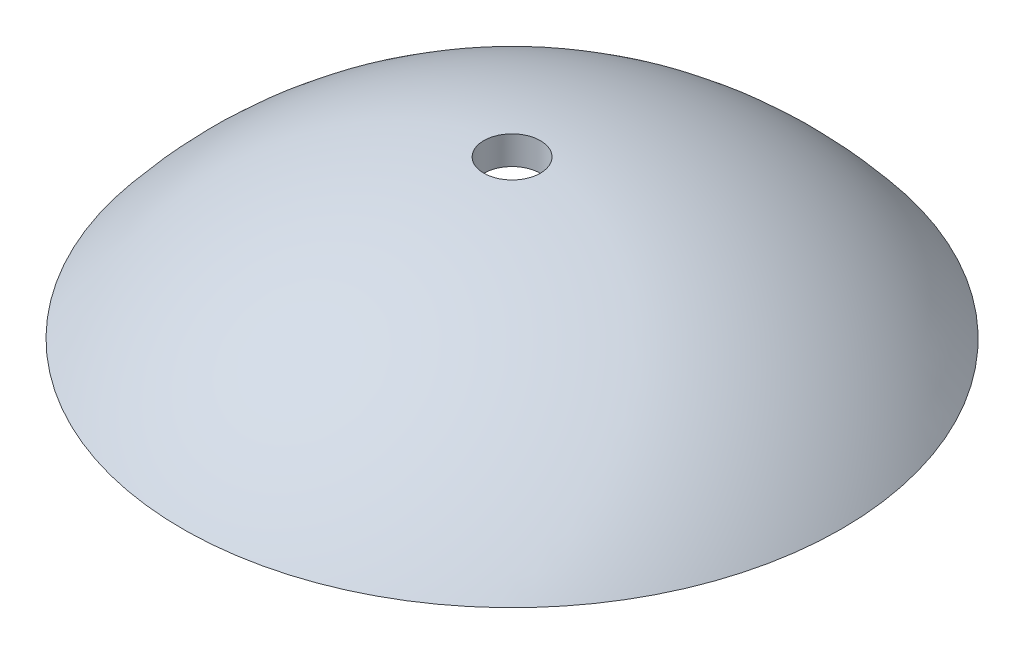
ISO-10303-21;
HEADER;
FILE_DESCRIPTION(('STEP AP214'),'2;1');
FILE_NAME('part.step','',(''),(''),'','','');
FILE_SCHEMA(('AUTOMOTIVE_DESIGN { 1 0 10303 214 1 1 1 1 }'));
ENDSEC;
DATA;
#1=APPLICATION_CONTEXT('core data for automotive mechanical design processes');
#2=APPLICATION_PROTOCOL_DEFINITION('international standard','automotive_design',2000,#1);
#3=PRODUCT_CONTEXT('',#1,'mechanical');
#4=PRODUCT('Part','Part','',(#3));
#5=PRODUCT_RELATED_PRODUCT_CATEGORY('part','',(#4));
#6=PRODUCT_DEFINITION_FORMATION('','',#4);
#7=PRODUCT_DEFINITION_CONTEXT('part definition',#1,'design');
#8=PRODUCT_DEFINITION('design','',#6,#7);
#9=PRODUCT_DEFINITION_SHAPE('','',#8);
#10=(LENGTH_UNIT() NAMED_UNIT(*) SI_UNIT(.MILLI.,.METRE.));
#11=(NAMED_UNIT(*) PLANE_ANGLE_UNIT() SI_UNIT($,.RADIAN.));
#12=(NAMED_UNIT(*) SI_UNIT($,.STERADIAN.) SOLID_ANGLE_UNIT());
#13=UNCERTAINTY_MEASURE_WITH_UNIT(LENGTH_MEASURE(1.E-05),#10,'distance_accuracy_value','');
#14=(GEOMETRIC_REPRESENTATION_CONTEXT(3) GLOBAL_UNCERTAINTY_ASSIGNED_CONTEXT((#13)) GLOBAL_UNIT_ASSIGNED_CONTEXT((#10,
#11,#12)) REPRESENTATION_CONTEXT('',''));
#15=CARTESIAN_POINT('',(0.,0.,0.));
#16=DIRECTION('',(0.,0.,1.));
#17=DIRECTION('',(1.,0.,0.));
#18=AXIS2_PLACEMENT_3D('',#15,#16,#17);
#19=CARTESIAN_POINT('',(0.,0.,0.));
#20=DIRECTION('',(0.,1.,0.));
#21=DIRECTION('',(1.,0.,0.));
#22=AXIS2_PLACEMENT_3D('',#19,#20,#21);
#23=SPHERICAL_SURFACE('',#22,22.4);
#24=CARTESIAN_POINT('',(0.,22.3497203561924,0.));
#25=DIRECTION('',(0.,-1.,0.));
#26=DIRECTION('',(0.,0.,-1.));
#27=AXIS2_PLACEMENT_3D('',#24,#25,#26);
#28=CIRCLE('',#27,1.5);
#29=CARTESIAN_POINT('',(1.50000000000001,22.3497203561924,0.));
#30=VERTEX_POINT('',#29);
#31=EDGE_CURVE('E43',#30,#30,#28,.F.);
#32=CARTESIAN_POINT('',(0.,14.,0.));
#33=DIRECTION('',(0.,1.,0.));
#34=DIRECTION('',(-1.,0.,0.));
#35=AXIS2_PLACEMENT_3D('',#32,#33,#34);
#36=CIRCLE('',#35,17.4859943955155);
#37=CARTESIAN_POINT('',(17.4859943955155,14.,0.));
#38=VERTEX_POINT('',#37);
#39=EDGE_CURVE('E10',#38,#38,#36,.F.);
#40=CARTESIAN_POINT('',(1.50000000000001,22.3497203561924,0.));
#41=CARTESIAN_POINT('',(1.69291780352596,22.336773294614,0.));
#42=CARTESIAN_POINT('',(1.88566785886011,22.3213272199969,0.));
#43=CARTESIAN_POINT('',(2.27070347402779,22.2854500379843,0.));
#44=CARTESIAN_POINT('',(2.46298903386131,22.2650189305888,0.));
#45=CARTESIAN_POINT('',(2.84696665891072,22.2191846763187,0.));
#46=CARTESIAN_POINT('',(3.0386587241266,22.193781529444,0.));
#47=CARTESIAN_POINT('',(3.42132084223482,22.1380204190691,0.));
#48=CARTESIAN_POINT('',(3.61229089512715,22.1076624555689,0.));
#49=CARTESIAN_POINT('',(3.99338093265185,22.0420120171622,0.));
#50=CARTESIAN_POINT('',(4.18350091728421,22.0067195422558,0.));
#51=CARTESIAN_POINT('',(4.56276333834086,21.9312237593005,0.));
#52=CARTESIAN_POINT('',(4.75190577476515,21.8910204512516,0.));
#53=CARTESIAN_POINT('',(5.12908627332778,21.8057299559071,0.));
#54=CARTESIAN_POINT('',(5.31712433546612,21.7606427686116,0.));
#55=CARTESIAN_POINT('',(5.69197000032561,21.6656147480757,0.));
#56=CARTESIAN_POINT('',(5.87877760304676,21.6156739148353,0.));
#57=CARTESIAN_POINT('',(6.25103708888571,21.5109720889913,0.));
#58=CARTESIAN_POINT('',(6.43648897200351,21.4562110963877,0.));
#59=CARTESIAN_POINT('',(6.80591266753158,21.3419056707931,0.));
#60=CARTESIAN_POINT('',(6.98988447994185,21.2823612378021,0.));
#61=CARTESIAN_POINT('',(7.3562246753747,21.1585288577619,0.));
#62=CARTESIAN_POINT('',(7.53859305839728,21.0942409107126,0.));
#63=CARTESIAN_POINT('',(7.90160411152481,20.9609646095786,0.));
#64=CARTESIAN_POINT('',(8.08224678162977,20.8919762554938,0.));
#65=CARTESIAN_POINT('',(8.44168528253438,20.7493453990706,0.));
#66=CARTESIAN_POINT('',(8.62048111333404,20.6757028967321,0.));
#67=CARTESIAN_POINT('',(8.97610604760227,20.5238131233326,0.));
#68=CARTESIAN_POINT('',(9.15293515107085,20.4455658522716,0.));
#69=CARTESIAN_POINT('',(9.50450806140143,20.2845190085947,0.));
#70=CARTESIAN_POINT('',(9.67925186826342,20.2017194359788,0.));
#71=CARTESIAN_POINT('',(10.0265370143599,20.0316235088161,0.));
#72=CARTESIAN_POINT('',(10.1990783535945,19.9443271542693,0.));
#73=CARTESIAN_POINT('',(10.5418428702365,19.7652961980975,0.));
#74=CARTESIAN_POINT('',(10.7120660476439,19.6735615964725,0.));
#75=CARTESIAN_POINT('',(11.0500801008301,19.4857156569761,0.));
#76=CARTESIAN_POINT('',(11.2178709766088,19.3896043191047,0.));
#77=CARTESIAN_POINT('',(11.5509079176675,19.1930693526817,0.));
#78=CARTESIAN_POINT('',(11.7161539829475,19.0926457241302,0.));
#79=CARTESIAN_POINT('',(12.0439905005119,18.8875535134349,0.));
#80=CARTESIAN_POINT('',(12.2065809527962,18.7828849312911,0.));
#81=CARTESIAN_POINT('',(12.5289972225407,18.569372996869,0.));
#82=CARTESIAN_POINT('',(12.6888230400008,18.4605296445908,0.));
#83=CARTESIAN_POINT('',(13.0056028720413,18.2387411526686,0.));
#84=CARTESIAN_POINT('',(13.1625568866217,18.1257960130247,0.));
#85=CARTESIAN_POINT('',(13.473487870473,17.8958796795086,0.));
#86=CARTESIAN_POINT('',(13.627464839744,17.7789084856365,0.));
#87=CARTESIAN_POINT('',(13.9323384867642,17.5410184764084,0.));
#88=CARTESIAN_POINT('',(14.0832351645135,17.4200996610524,0.));
#89=CARTESIAN_POINT('',(14.381847047639,17.1743954885433,0.));
#90=CARTESIAN_POINT('',(14.5295622530151,17.0496101313901,0.));
#91=CARTESIAN_POINT('',(14.8217121440709,16.7962565478215,0.));
#92=CARTESIAN_POINT('',(14.9661468297504,16.6676883214061,0.));
#93=CARTESIAN_POINT('',(15.2516388328281,16.406855207575,0.));
#94=CARTESIAN_POINT('',(15.3926961502261,16.2745903201595,0.));
#95=CARTESIAN_POINT('',(15.671338836327,16.0064525743043,0.));
#96=CARTESIAN_POINT('',(15.8089242050298,15.8705797158647,0.));
#97=CARTESIAN_POINT('',(16.0805307281491,15.5953171260299,0.));
#98=CARTESIAN_POINT('',(16.2145518825657,15.4559273946347,0.));
#99=CARTESIAN_POINT('',(16.4789401507886,15.1737245567833,0.));
#100=CARTESIAN_POINT('',(16.609307264595,15.0309114503271,0.));
#101=CARTESIAN_POINT('',(16.8662998912295,14.7419575002613,0.));
#102=CARTESIAN_POINT('',(16.9929254040575,14.5958166566517,0.));
#103=CARTESIAN_POINT('',(17.2423504646278,14.300305681735,0.));
#104=CARTESIAN_POINT('',(17.36515001237,14.1509355504279,0.));
#105=CARTESIAN_POINT('',(17.4859943955155,14.,0.));
#106=B_SPLINE_CURVE_WITH_KNOTS('',3,(#40,#41,#42,#43,#44,#45,#46,#47,#48,#49,#50,#51,#52,#53,
#54,#55,#56,#57,#58,#59,#60,#61,#62,#63,#64,#65,#66,#67,#68,#69,#70,#71,#72,#73,#74,#75,#76,#77,
#78,#79,#80,#81,#82,#83,#84,#85,#86,#87,#88,#89,#90,#91,#92,#93,#94,#95,#96,#97,#98,#99,#100,
#101,#102,#103,#104,#105),.UNSPECIFIED.,.F.,.F.,(4,2,2,2,2,2,2,2,2,2,2,2,2,2,2,2,2,2,2,2,2,2,2,
2,2,2,2,2,2,2,2,2,4),(0.,0.580039045088101,1.1600780901762,1.7401171352643,2.3201561803524,
2.9001952254405,3.4802342705286,4.0602733156167,4.6403123607048,5.2203514057929,5.800390450881,
6.3804294959691,6.9604685410572,7.5405075861453,8.1205466312334,8.7005856763215,9.2806247214096,
9.8606637664977,10.4407028115858,11.0207418566739,11.600780901762,12.1808199468501,
12.7608589919382,13.3408980370263,13.9209370821144,14.5009761272025,15.0810151722906,
15.6610542173787,16.2410932624668,16.8211323075549,17.401171352643,17.9812103977311,
18.5612494428192),.UNSPECIFIED.);
#107=EDGE_CURVE('BSEAM31',#30,#38,#106,.T.);
#108=ORIENTED_EDGE('',*,*,#31,.F.);
#109=ORIENTED_EDGE('',*,*,#39,.F.);
#110=ORIENTED_EDGE('',*,*,#107,.T.);
#111=ORIENTED_EDGE('',*,*,#107,.F.);
#112=EDGE_LOOP('',(#108,#110,#109,#111));
#113=FACE_BOUND('',#112,.T.);
#114=ADVANCED_FACE('F31',(#113),#23,.T.);
#115=CARTESIAN_POINT('',(32.3969928061217,14.,-25.));
#116=DIRECTION('',(0.,1.,0.));
#117=DIRECTION('',(-1.,0.,0.));
#118=AXIS2_PLACEMENT_3D('',#115,#116,#117);
#119=PLANE('',#118);
#120=CARTESIAN_POINT('',(0.,14.,0.));
#121=DIRECTION('',(0.,1.,0.));
#122=DIRECTION('',(-1.,0.,0.));
#123=AXIS2_PLACEMENT_3D('',#120,#121,#122);
#124=CIRCLE('',#123,15.5180540017104);
#125=CARTESIAN_POINT('',(-15.5180540017104,14.,0.));
#126=VERTEX_POINT('',#125);
#127=EDGE_CURVE('E38',#126,#126,#124,.T.);
#128=ORIENTED_EDGE('',*,*,#127,.T.);
#129=EDGE_LOOP('',(#128));
#130=FACE_BOUND('',#129,.T.);
#131=ORIENTED_EDGE('',*,*,#39,.T.);
#132=EDGE_LOOP('',(#131));
#133=FACE_BOUND('',#132,.T.);
#134=ADVANCED_FACE('F60',(#130,#133),#119,.F.);
#135=CARTESIAN_POINT('',(0.,0.,0.));
#136=DIRECTION('',(0.,1.,0.));
#137=DIRECTION('',(-1.,0.,0.));
#138=AXIS2_PLACEMENT_3D('',#135,#136,#137);
#139=SPHERICAL_SURFACE('',#138,20.9);
#140=CARTESIAN_POINT('',(0.,20.8461027532726,0.));
#141=DIRECTION('',(0.,-1.,0.));
#142=DIRECTION('',(0.,0.,-1.));
#143=AXIS2_PLACEMENT_3D('',#140,#141,#142);
#144=CIRCLE('',#143,1.5);
#145=CARTESIAN_POINT('',(-1.50000000000002,20.8461027532726,0.));
#146=VERTEX_POINT('',#145);
#147=EDGE_CURVE('E34',#146,#146,#144,.F.);
#148=CARTESIAN_POINT('',(-1.50000000000002,20.8461027532726,0.));
#149=CARTESIAN_POINT('',(-1.66610629923324,20.8341508351029,0.));
#150=CARTESIAN_POINT('',(-1.83206966596617,20.8202127621637,0.));
#151=CARTESIAN_POINT('',(-2.16361587360884,20.788374056771,0.));
#152=CARTESIAN_POINT('',(-2.32919871451858,20.7704734243175,0.));
#153=CARTESIAN_POINT('',(-2.65988920969227,20.7307193499208,0.));
#154=CARTESIAN_POINT('',(-2.82499686395623,20.7088659079776,0.));
#155=CARTESIAN_POINT('',(-3.1546426548012,20.6612188299791,0.));
#156=CARTESIAN_POINT('',(-3.31918079138222,20.6354251939238,0.));
#157=CARTESIAN_POINT('',(-3.64759352563833,20.5799124319614,0.));
#158=CARTESIAN_POINT('',(-3.81146812331343,20.5501933060543,0.));
#159=CARTESIAN_POINT('',(-4.13846014186721,20.4868465552525,0.));
#160=CARTESIAN_POINT('',(-4.3015775627459,20.4532189303577,0.));
#161=CARTESIAN_POINT('',(-4.62696202135018,20.3820743941089,0.));
#162=CARTESIAN_POINT('',(-4.78922905907579,20.344557482755,0.));
#163=CARTESIAN_POINT('',(-5.11282003123079,20.2656558116019,0.));
#164=CARTESIAN_POINT('',(-5.2741439656602,20.2242710518027,0.));
#165=CARTESIAN_POINT('',(-5.59575654989323,20.1376573310431,0.));
#166=CARTESIAN_POINT('',(-5.75604519969685,20.0924283700828,0.));
#167=CARTESIAN_POINT('',(-6.07549562493717,19.9981520911056,0.));
#168=CARTESIAN_POINT('',(-6.23465740037386,19.9491047730887,0.));
#169=CARTESIAN_POINT('',(-6.55176313103511,19.8472198058716,0.));
#170=CARTESIAN_POINT('',(-6.70970708625967,19.7943821566713,0.));
#171=CARTESIAN_POINT('',(-7.02428692652161,19.6849467187907,0.));
#172=CARTESIAN_POINT('',(-7.18092281155899,19.6283489301105,0.));
#173=CARTESIAN_POINT('',(-7.49279700890908,19.5114255535321,0.));
#174=CARTESIAN_POINT('',(-7.64803532122177,19.451099965634,0.));
#175=CARTESIAN_POINT('',(-7.9570256691652,19.3267554609662,0.));
#176=CARTESIAN_POINT('',(-8.11077770479593,19.2627365441966,0.));
#177=CARTESIAN_POINT('',(-8.41670764468412,19.1310419625188,0.));
#178=CARTESIAN_POINT('',(-8.56888554894159,19.0633662976107,0.));
#179=CARTESIAN_POINT('',(-8.87158027085861,18.9243968898735,0.));
#180=CARTESIAN_POINT('',(-9.02209708851817,18.8531031470443,0.));
#181=CARTESIAN_POINT('',(-9.321383631168,18.7069383210704,0.));
#182=CARTESIAN_POINT('',(-9.47015335615828,18.6320672379257,0.));
#183=CARTESIAN_POINT('',(-9.7658607056958,18.4787905130365,0.));
#184=CARTESIAN_POINT('',(-9.91279833024304,18.400384871292,0.));
#185=CARTESIAN_POINT('',(-10.2047575179921,18.2400838305838,0.));
#186=CARTESIAN_POINT('',(-10.349779081194,18.15818843162,0.));
#187=CARTESIAN_POINT('',(-10.6378232801973,17.9909546719187,0.));
#188=CARTESIAN_POINT('',(-10.7808459159987,17.9056163111812,0.));
#189=CARTESIAN_POINT('',(-11.0648105363429,17.7315453907033,0.));
#190=CARTESIAN_POINT('',(-11.2057525208858,17.642812830963,0.));
#191=CARTESIAN_POINT('',(-11.4854753037503,17.4620042147141,0.));
#192=CARTESIAN_POINT('',(-11.6242561020719,17.3699281582054,0.));
#193=CARTESIAN_POINT('',(-11.8995772124411,17.1824851611419,0.));
#194=CARTESIAN_POINT('',(-12.0361175244886,17.0871182205871,0.));
#195=CARTESIAN_POINT('',(-12.3068796424934,16.8931479485927,0.));
#196=CARTESIAN_POINT('',(-12.4411014484506,16.7945446171531,0.));
#197=CARTESIAN_POINT('',(-12.7071498592211,16.5941579057989,0.));
#198=CARTESIAN_POINT('',(-12.8389764640344,16.4923745258843,0.));
#199=CARTESIAN_POINT('',(-13.1001591462568,16.2856858772408,0.));
#200=CARTESIAN_POINT('',(-13.2295152236661,16.180780608512,0.));
#201=CARTESIAN_POINT('',(-13.485682935881,15.967908125185,0.));
#202=CARTESIAN_POINT('',(-13.6124945706868,15.8599409105869,0.));
#203=CARTESIAN_POINT('',(-13.8635009386844,15.6410062302375,0.));
#204=CARTESIAN_POINT('',(-13.9876956718763,15.5300387644864,0.));
#205=CARTESIAN_POINT('',(-14.2333972644312,15.3051669828456,0.));
#206=CARTESIAN_POINT('',(-14.3549041237941,15.191262666956,0.));
#207=CARTESIAN_POINT('',(-14.5951605641214,14.960582294265,0.));
#208=CARTESIAN_POINT('',(-14.7139101450857,14.8438062374635,0.));
#209=CARTESIAN_POINT('',(-14.9485840809611,14.6074490208398,0.));
#210=CARTESIAN_POINT('',(-15.0645084358721,14.4878678610175,0.));
#211=CARTESIAN_POINT('',(-15.2934660289859,14.2459690980632,0.));
#212=CARTESIAN_POINT('',(-15.4064992671888,14.1236514949312,0.));
#213=CARTESIAN_POINT('',(-15.5180540017104,14.,0.));
#214=B_SPLINE_CURVE_WITH_KNOTS('',3,(#148,#149,#150,#151,#152,#153,#154,#155,#156,#157,#158,
#159,#160,#161,#162,#163,#164,#165,#166,#167,#168,#169,#170,#171,#172,#173,#174,#175,#176,#177,
#178,#179,#180,#181,#182,#183,#184,#185,#186,#187,#188,#189,#190,#191,#192,#193,#194,#195,#196,
#197,#198,#199,#200,#201,#202,#203,#204,#205,#206,#207,#208,#209,#210,#211,#212,#213),
.UNSPECIFIED.,.F.,.F.,(4,2,2,2,2,2,2,2,2,2,2,2,2,2,2,2,2,2,2,2,2,2,2,2,2,2,2,2,2,2,2,2,4),(0.,
0.499595280861523,0.99919056172305,1.49878584258457,1.9983811234461,2.49797640430762,
2.99757168516914,3.49716696603067,3.99676224689219,4.49635752775372,4.99595280861524,
5.49554808947676,5.99514337033829,6.49473865119981,6.99433393206134,7.49392921292286,
7.99352449378438,8.49311977464591,8.99271505550743,9.49231033636896,9.99190561723048,
10.491500898092,10.9910961789535,11.4906914598151,11.9902867406766,12.4898820215381,
12.9894773023996,13.4890725832612,13.9886678641227,14.4882631449842,14.9878584258457,
15.4874537067072,15.9870489875688),.UNSPECIFIED.);
#215=EDGE_CURVE('BSEAM51',#146,#126,#214,.T.);
#216=ORIENTED_EDGE('',*,*,#147,.T.);
#217=ORIENTED_EDGE('',*,*,#127,.F.);
#218=ORIENTED_EDGE('',*,*,#215,.T.);
#219=ORIENTED_EDGE('',*,*,#215,.F.);
#220=EDGE_LOOP('',(#216,#218,#217,#219));
#221=FACE_BOUND('',#220,.T.);
#222=ADVANCED_FACE('F51',(#221),#139,.F.);
#223=CARTESIAN_POINT('',(0.,-25.,0.));
#224=DIRECTION('',(0.,1.,0.));
#225=DIRECTION('',(0.,0.,1.));
#226=AXIS2_PLACEMENT_3D('',#223,#224,#225);
#227=CYLINDRICAL_SURFACE('',#226,1.5);
#228=ORIENTED_EDGE('',*,*,#31,.T.);
#229=EDGE_LOOP('',(#228));
#230=FACE_BOUND('',#229,.T.);
#231=ORIENTED_EDGE('',*,*,#147,.F.);
#232=EDGE_LOOP('',(#231));
#233=FACE_BOUND('',#232,.T.);
#234=ADVANCED_FACE('F54',(#230,#233),#227,.F.);
#235=CLOSED_SHELL('',(#114,#134,#222,#234));
#236=MANIFOLD_SOLID_BREP('B2',#235);
#237=ADVANCED_BREP_SHAPE_REPRESENTATION('',(#18,#236),#14);
#238=SHAPE_DEFINITION_REPRESENTATION(#9,#237);
ENDSEC;
END-ISO-10303-21;
